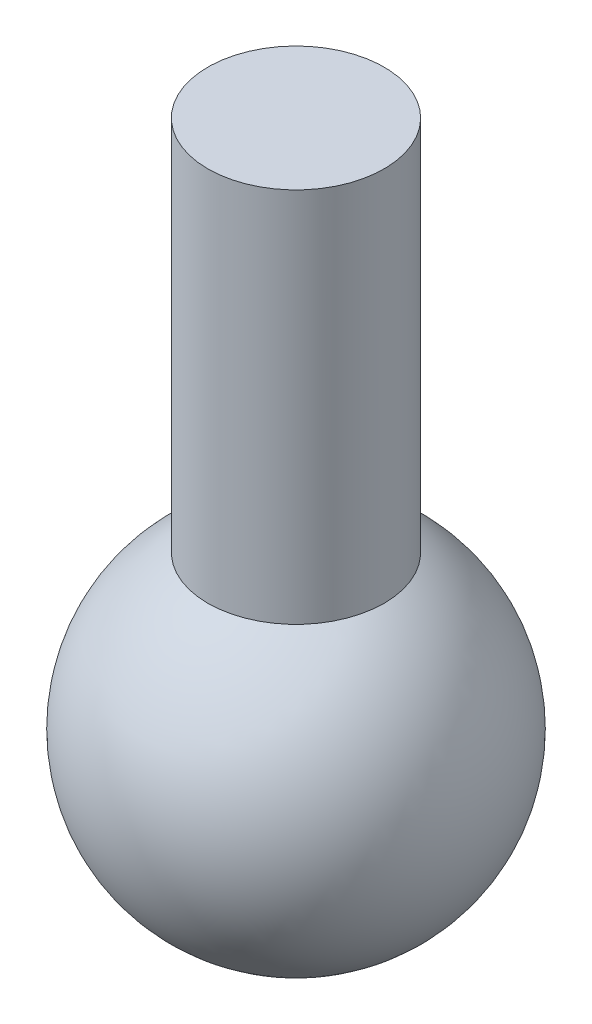
ISO-10303-21;
HEADER;
FILE_DESCRIPTION(('STEP AP214'),'2;1');
FILE_NAME('part.step','',(''),(''),'','','');
FILE_SCHEMA(('AUTOMOTIVE_DESIGN { 1 0 10303 214 1 1 1 1 }'));
ENDSEC;
DATA;
#1=APPLICATION_CONTEXT('core data for automotive mechanical design processes');
#2=APPLICATION_PROTOCOL_DEFINITION('international standard','automotive_design',2000,#1);
#3=PRODUCT_CONTEXT('',#1,'mechanical');
#4=PRODUCT('Part','Part','',(#3));
#5=PRODUCT_RELATED_PRODUCT_CATEGORY('part','',(#4));
#6=PRODUCT_DEFINITION_FORMATION('','',#4);
#7=PRODUCT_DEFINITION_CONTEXT('part definition',#1,'design');
#8=PRODUCT_DEFINITION('design','',#6,#7);
#9=PRODUCT_DEFINITION_SHAPE('','',#8);
#10=(LENGTH_UNIT() NAMED_UNIT(*) SI_UNIT(.MILLI.,.METRE.));
#11=(NAMED_UNIT(*) PLANE_ANGLE_UNIT() SI_UNIT($,.RADIAN.));
#12=(NAMED_UNIT(*) SI_UNIT($,.STERADIAN.) SOLID_ANGLE_UNIT());
#13=UNCERTAINTY_MEASURE_WITH_UNIT(LENGTH_MEASURE(1.E-05),#10,'distance_accuracy_value','');
#14=(GEOMETRIC_REPRESENTATION_CONTEXT(3) GLOBAL_UNCERTAINTY_ASSIGNED_CONTEXT((#13)) GLOBAL_UNIT_ASSIGNED_CONTEXT((#10,
#11,#12)) REPRESENTATION_CONTEXT('',''));
#15=CARTESIAN_POINT('',(0.,0.,0.));
#16=DIRECTION('',(0.,0.,1.));
#17=DIRECTION('',(1.,0.,0.));
#18=AXIS2_PLACEMENT_3D('',#15,#16,#17);
#19=CARTESIAN_POINT('',(0.,3.,0.));
#20=DIRECTION('',(0.,1.,0.));
#21=DIRECTION('',(1.,0.,0.));
#22=AXIS2_PLACEMENT_3D('',#19,#20,#21);
#23=SPHERICAL_SURFACE('',#22,3.);
#24=CARTESIAN_POINT('',(0.,5.59807621135332,0.));
#25=DIRECTION('',(0.,1.,0.));
#26=DIRECTION('',(0.,0.,1.));
#27=AXIS2_PLACEMENT_3D('',#24,#25,#26);
#28=CIRCLE('',#27,1.5);
#29=CARTESIAN_POINT('',(0.,5.59807621135332,1.5));
#30=VERTEX_POINT('',#29);
#31=EDGE_CURVE('E10',#30,#30,#28,.T.);
#32=ORIENTED_EDGE('',*,*,#31,.F.);
#33=EDGE_LOOP('',(#32));
#34=FACE_BOUND('',#33,.T.);
#35=ADVANCED_FACE('F31',(#34),#23,.T.);
#36=CARTESIAN_POINT('',(0.,0.,0.));
#37=DIRECTION('',(0.,1.,0.));
#38=DIRECTION('',(0.,0.,1.));
#39=AXIS2_PLACEMENT_3D('',#36,#37,#38);
#40=CYLINDRICAL_SURFACE('',#39,1.5);
#41=CARTESIAN_POINT('',(0.,12.,0.));
#42=DIRECTION('',(0.,1.,0.));
#43=DIRECTION('',(0.,0.,1.));
#44=AXIS2_PLACEMENT_3D('',#41,#42,#43);
#45=CIRCLE('',#44,1.5);
#46=CARTESIAN_POINT('',(0.,12.,1.5));
#47=VERTEX_POINT('',#46);
#48=EDGE_CURVE('E37',#47,#47,#45,.T.);
#49=ORIENTED_EDGE('',*,*,#48,.F.);
#50=EDGE_LOOP('',(#49));
#51=FACE_BOUND('',#50,.T.);
#52=ORIENTED_EDGE('',*,*,#31,.T.);
#53=EDGE_LOOP('',(#52));
#54=FACE_BOUND('',#53,.T.);
#55=ADVANCED_FACE('F45',(#51,#54),#40,.T.);
#56=CARTESIAN_POINT('',(0.,12.,0.));
#57=DIRECTION('',(0.,-1.,0.));
#58=DIRECTION('',(0.,0.,-1.));
#59=AXIS2_PLACEMENT_3D('',#56,#57,#58);
#60=PLANE('',#59);
#61=ORIENTED_EDGE('',*,*,#48,.T.);
#62=EDGE_LOOP('',(#61));
#63=FACE_BOUND('',#62,.T.);
#64=ADVANCED_FACE('F43',(#63),#60,.F.);
#65=CLOSED_SHELL('',(#35,#55,#64));
#66=MANIFOLD_SOLID_BREP('B2',#65);
#67=ADVANCED_BREP_SHAPE_REPRESENTATION('',(#18,#66),#14);
#68=SHAPE_DEFINITION_REPRESENTATION(#9,#67);
ENDSEC;
END-ISO-10303-21;
